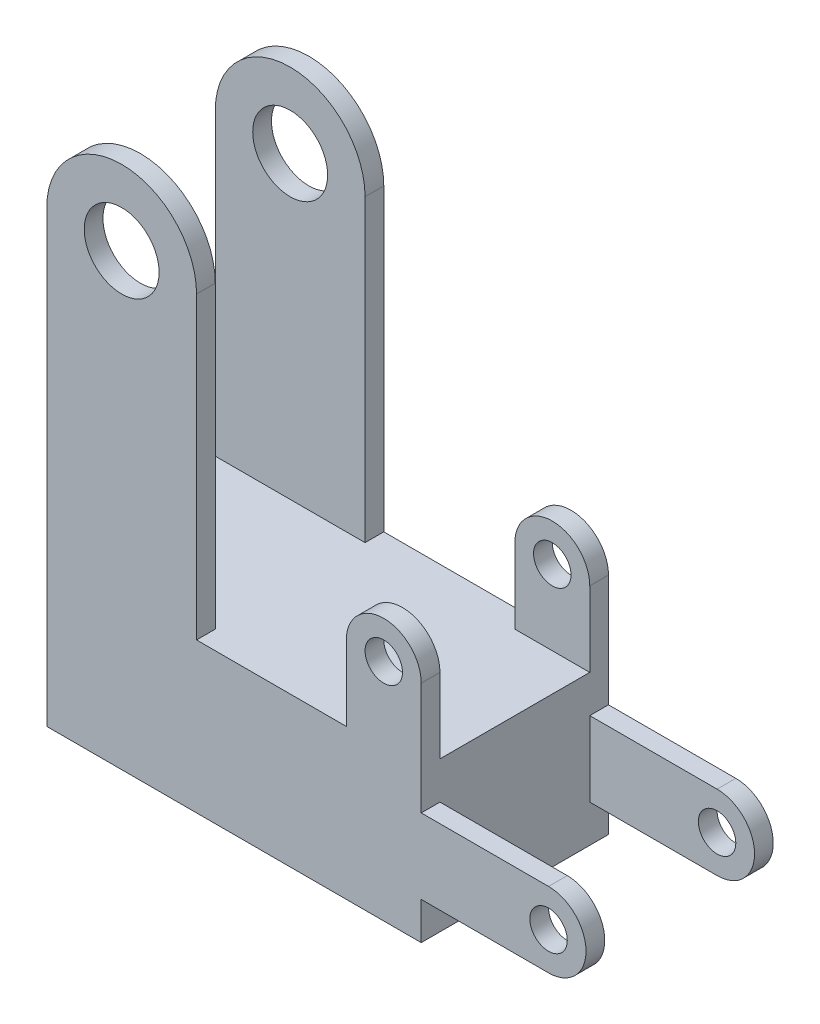
ISO-10303-21;
HEADER;
FILE_DESCRIPTION(('STEP AP214'),'2;1');
FILE_NAME('part.step','',(''),(''),'','','');
FILE_SCHEMA(('AUTOMOTIVE_DESIGN { 1 0 10303 214 1 1 1 1 }'));
ENDSEC;
DATA;
#1=APPLICATION_CONTEXT('core data for automotive mechanical design processes');
#2=APPLICATION_PROTOCOL_DEFINITION('international standard','automotive_design',2000,#1);
#3=PRODUCT_CONTEXT('',#1,'mechanical');
#4=PRODUCT('Part','Part','',(#3));
#5=PRODUCT_RELATED_PRODUCT_CATEGORY('part','',(#4));
#6=PRODUCT_DEFINITION_FORMATION('','',#4);
#7=PRODUCT_DEFINITION_CONTEXT('part definition',#1,'design');
#8=PRODUCT_DEFINITION('design','',#6,#7);
#9=PRODUCT_DEFINITION_SHAPE('','',#8);
#10=(LENGTH_UNIT() NAMED_UNIT(*) SI_UNIT(.MILLI.,.METRE.));
#11=(NAMED_UNIT(*) PLANE_ANGLE_UNIT() SI_UNIT($,.RADIAN.));
#12=(NAMED_UNIT(*) SI_UNIT($,.STERADIAN.) SOLID_ANGLE_UNIT());
#13=UNCERTAINTY_MEASURE_WITH_UNIT(LENGTH_MEASURE(1.E-05),#10,'distance_accuracy_value','');
#14=(GEOMETRIC_REPRESENTATION_CONTEXT(3) GLOBAL_UNCERTAINTY_ASSIGNED_CONTEXT((#13)) GLOBAL_UNIT_ASSIGNED_CONTEXT((#10,
#11,#12)) REPRESENTATION_CONTEXT('',''));
#15=CARTESIAN_POINT('',(0.,0.,0.));
#16=DIRECTION('',(0.,0.,1.));
#17=DIRECTION('',(1.,0.,0.));
#18=AXIS2_PLACEMENT_3D('',#15,#16,#17);
#19=CARTESIAN_POINT('',(17.9383444264069,-15.2443150098857,25.));
#20=DIRECTION('',(0.,1.,0.));
#21=DIRECTION('',(-1.,0.,0.));
#22=AXIS2_PLACEMENT_3D('',#19,#20,#21);
#23=PLANE('',#22);
#24=DIRECTION('',(0.,0.,-1.));
#25=VECTOR('',#24,1.);
#26=CARTESIAN_POINT('',(17.9383444264069,-15.2443150098857,25.));
#27=LINE('',#26,#25);
#28=CARTESIAN_POINT('',(17.9383444264069,-15.2443150098857,2.5));
#29=VERTEX_POINT('',#28);
#30=CARTESIAN_POINT('',(17.9383444264069,-15.2443150098857,0.));
#31=VERTEX_POINT('',#30);
#32=EDGE_CURVE('E235',#29,#31,#27,.T.);
#33=ORIENTED_EDGE('',*,*,#32,.F.);
#34=DIRECTION('',(1.,0.,0.));
#35=VECTOR('',#34,1.);
#36=CARTESIAN_POINT('',(0.938344426406875,-15.2443150098857,2.5));
#37=LINE('',#36,#35);
#38=CARTESIAN_POINT('',(0.938344426406876,-15.2443150098857,2.5));
#39=VERTEX_POINT('',#38);
#40=EDGE_CURVE('E219',#39,#29,#37,.T.);
#41=ORIENTED_EDGE('',*,*,#40,.F.);
#42=DIRECTION('',(0.,0.,-1.));
#43=VECTOR('',#42,1.);
#44=CARTESIAN_POINT('',(0.938344426406874,-15.2443150098857,25.));
#45=LINE('',#44,#43);
#46=CARTESIAN_POINT('',(0.938344426406874,-15.2443150098857,0.));
#47=VERTEX_POINT('',#46);
#48=EDGE_CURVE('E243',#39,#47,#45,.T.);
#49=ORIENTED_EDGE('',*,*,#48,.T.);
#50=DIRECTION('',(1.,0.,0.));
#51=VECTOR('',#50,1.);
#52=CARTESIAN_POINT('',(17.9383444264069,-15.2443150098857,0.));
#53=LINE('',#52,#51);
#54=EDGE_CURVE('E356',#47,#31,#53,.T.);
#55=ORIENTED_EDGE('',*,*,#54,.T.);
#56=EDGE_LOOP('',(#33,#41,#49,#55));
#57=FACE_BOUND('',#56,.T.);
#58=ADVANCED_FACE('F46',(#57),#23,.F.);
#59=CARTESIAN_POINT('',(17.9383444264069,-10.2443150098857,25.));
#60=DIRECTION('',(0.,0.,-1.));
#61=DIRECTION('',(-1.,0.,0.));
#62=AXIS2_PLACEMENT_3D('',#59,#60,#61);
#63=CYLINDRICAL_SURFACE('',#62,5.);
#64=DIRECTION('',(0.,0.,-1.));
#65=VECTOR('',#64,1.);
#66=CARTESIAN_POINT('',(17.9383444264069,-5.24431500988574,25.));
#67=LINE('',#66,#65);
#68=CARTESIAN_POINT('',(17.9383444264069,-5.24431500988574,2.5));
#69=VERTEX_POINT('',#68);
#70=CARTESIAN_POINT('',(17.9383444264069,-5.24431500988574,0.));
#71=VERTEX_POINT('',#70);
#72=EDGE_CURVE('E236',#69,#71,#67,.T.);
#73=ORIENTED_EDGE('',*,*,#72,.F.);
#74=CARTESIAN_POINT('',(17.9383444264069,-10.2443150098857,2.5));
#75=DIRECTION('',(0.,0.,-1.));
#76=DIRECTION('',(-1.,0.,0.));
#77=AXIS2_PLACEMENT_3D('',#74,#75,#76);
#78=CIRCLE('',#77,5.);
#79=EDGE_CURVE('E230',#29,#69,#78,.F.);
#80=ORIENTED_EDGE('',*,*,#79,.F.);
#81=ORIENTED_EDGE('',*,*,#32,.T.);
#82=CARTESIAN_POINT('',(17.9383444264069,-10.2443150098857,0.));
#83=DIRECTION('',(0.,0.,1.));
#84=DIRECTION('',(-1.,0.,0.));
#85=AXIS2_PLACEMENT_3D('',#82,#83,#84);
#86=CIRCLE('',#85,5.);
#87=EDGE_CURVE('E359',#31,#71,#86,.T.);
#88=ORIENTED_EDGE('',*,*,#87,.T.);
#89=EDGE_LOOP('',(#73,#80,#81,#88));
#90=FACE_BOUND('',#89,.T.);
#91=ADVANCED_FACE('F471',(#90),#63,.T.);
#92=CARTESIAN_POINT('',(0.938344426406872,-5.24431500988574,25.));
#93=DIRECTION('',(0.,-1.,0.));
#94=DIRECTION('',(0.,0.,-1.));
#95=AXIS2_PLACEMENT_3D('',#92,#93,#94);
#96=PLANE('',#95);
#97=DIRECTION('',(0.,0.,-1.));
#98=VECTOR('',#97,1.);
#99=CARTESIAN_POINT('',(0.938344426406872,-5.24431500988574,25.));
#100=LINE('',#99,#98);
#101=CARTESIAN_POINT('',(0.938344426406872,-5.24431500988574,2.5));
#102=VERTEX_POINT('',#101);
#103=CARTESIAN_POINT('',(0.938344426406872,-5.24431500988574,0.));
#104=VERTEX_POINT('',#103);
#105=EDGE_CURVE('E408',#102,#104,#100,.T.);
#106=ORIENTED_EDGE('',*,*,#105,.F.);
#107=DIRECTION('',(-1.,0.,0.));
#108=VECTOR('',#107,1.);
#109=CARTESIAN_POINT('',(0.938344426406876,-5.24431500988574,2.5));
#110=LINE('',#109,#108);
#111=EDGE_CURVE('E63',#69,#102,#110,.T.);
#112=ORIENTED_EDGE('',*,*,#111,.F.);
#113=ORIENTED_EDGE('',*,*,#72,.T.);
#114=DIRECTION('',(-1.,0.,0.));
#115=VECTOR('',#114,1.);
#116=CARTESIAN_POINT('',(0.938344426406872,-5.24431500988574,0.));
#117=LINE('',#116,#115);
#118=EDGE_CURVE('E362',#71,#104,#117,.T.);
#119=ORIENTED_EDGE('',*,*,#118,.T.);
#120=EDGE_LOOP('',(#106,#112,#113,#119));
#121=FACE_BOUND('',#120,.T.);
#122=ADVANCED_FACE('F467',(#121),#96,.F.);
#123=CARTESIAN_POINT('',(-4.06165557359312,9.75568499011426,25.));
#124=DIRECTION('',(0.,0.,-1.));
#125=DIRECTION('',(-1.,0.,0.));
#126=AXIS2_PLACEMENT_3D('',#123,#124,#125);
#127=CYLINDRICAL_SURFACE('',#126,5.);
#128=DIRECTION('',(0.,0.,-1.));
#129=VECTOR('',#128,1.);
#130=CARTESIAN_POINT('',(0.938344426406877,9.75568499011426,25.));
#131=LINE('',#130,#129);
#132=CARTESIAN_POINT('',(0.938344426406877,9.75568499011426,25.));
#133=VERTEX_POINT('',#132);
#134=CARTESIAN_POINT('',(0.938344426406877,9.75568499011426,22.5));
#135=VERTEX_POINT('',#134);
#136=EDGE_CURVE('E406',#133,#135,#131,.T.);
#137=ORIENTED_EDGE('',*,*,#136,.T.);
#138=CARTESIAN_POINT('',(-4.06165557359312,9.75568499011426,22.5));
#139=DIRECTION('',(0.,0.,1.));
#140=DIRECTION('',(1.,0.,0.));
#141=AXIS2_PLACEMENT_3D('',#138,#139,#140);
#142=CIRCLE('',#141,5.);
#143=CARTESIAN_POINT('',(-9.06165557359313,9.75568499011426,22.5));
#144=VERTEX_POINT('',#143);
#145=EDGE_CURVE('E318',#135,#144,#142,.T.);
#146=ORIENTED_EDGE('',*,*,#145,.T.);
#147=DIRECTION('',(0.,0.,-1.));
#148=VECTOR('',#147,1.);
#149=CARTESIAN_POINT('',(-9.06165557359313,9.75568499011426,25.));
#150=LINE('',#149,#148);
#151=CARTESIAN_POINT('',(-9.06165557359313,9.75568499011426,25.));
#152=VERTEX_POINT('',#151);
#153=EDGE_CURVE('E403',#152,#144,#150,.T.);
#154=ORIENTED_EDGE('',*,*,#153,.F.);
#155=CARTESIAN_POINT('',(-4.06165557359312,9.75568499011426,25.));
#156=DIRECTION('',(0.,0.,1.));
#157=DIRECTION('',(-1.,0.,0.));
#158=AXIS2_PLACEMENT_3D('',#155,#156,#157);
#159=CIRCLE('',#158,5.);
#160=EDGE_CURVE('E338',#133,#152,#159,.T.);
#161=ORIENTED_EDGE('',*,*,#160,.F.);
#162=EDGE_LOOP('',(#137,#146,#154,#161));
#163=FACE_BOUND('',#162,.T.);
#164=ADVANCED_FACE('F444',(#163),#127,.T.);
#165=CARTESIAN_POINT('',(-9.06165557359313,-0.244315009885743,25.));
#166=DIRECTION('',(1.,0.,0.));
#167=DIRECTION('',(0.,0.,-1.));
#168=AXIS2_PLACEMENT_3D('',#165,#166,#167);
#169=PLANE('',#168);
#170=ORIENTED_EDGE('',*,*,#153,.T.);
#171=DIRECTION('',(0.,-1.,0.));
#172=VECTOR('',#171,1.);
#173=CARTESIAN_POINT('',(-9.06165557359313,-0.244315009885743,22.5));
#174=LINE('',#173,#172);
#175=CARTESIAN_POINT('',(-9.06165557359313,-0.244315009885742,22.5));
#176=VERTEX_POINT('',#175);
#177=EDGE_CURVE('E315',#144,#176,#174,.T.);
#178=ORIENTED_EDGE('',*,*,#177,.T.);
#179=DIRECTION('',(0.,0.,-1.));
#180=VECTOR('',#179,1.);
#181=CARTESIAN_POINT('',(-9.06165557359313,-0.244315009885743,25.));
#182=LINE('',#181,#180);
#183=CARTESIAN_POINT('',(-9.06165557359313,-0.244315009885743,25.));
#184=VERTEX_POINT('',#183);
#185=EDGE_CURVE('E399',#184,#176,#182,.T.);
#186=ORIENTED_EDGE('',*,*,#185,.F.);
#187=DIRECTION('',(0.,-1.,0.));
#188=VECTOR('',#187,1.);
#189=CARTESIAN_POINT('',(-9.06165557359313,-0.244315009885743,25.));
#190=LINE('',#189,#188);
#191=EDGE_CURVE('E340',#152,#184,#190,.T.);
#192=ORIENTED_EDGE('',*,*,#191,.F.);
#193=EDGE_LOOP('',(#170,#178,#186,#192));
#194=FACE_BOUND('',#193,.T.);
#195=ADVANCED_FACE('F441',(#194),#169,.F.);
#196=CARTESIAN_POINT('',(-29.0616555735931,39.7556849901143,25.));
#197=DIRECTION('',(-1.,0.,0.));
#198=DIRECTION('',(0.,-1.,0.));
#199=AXIS2_PLACEMENT_3D('',#196,#197,#198);
#200=PLANE('',#199);
#201=DIRECTION('',(0.,0.,-1.));
#202=VECTOR('',#201,1.);
#203=CARTESIAN_POINT('',(-29.0616555735931,-0.244315009885744,25.));
#204=LINE('',#203,#202);
#205=CARTESIAN_POINT('',(-29.0616555735931,-0.244315009885744,25.));
#206=VERTEX_POINT('',#205);
#207=CARTESIAN_POINT('',(-29.0616555735931,-0.244315009885745,22.5));
#208=VERTEX_POINT('',#207);
#209=EDGE_CURVE('E395',#206,#208,#204,.T.);
#210=ORIENTED_EDGE('',*,*,#209,.T.);
#211=DIRECTION('',(0.,1.,0.));
#212=VECTOR('',#211,1.);
#213=CARTESIAN_POINT('',(-29.0616555735931,39.7556849901143,22.5));
#214=LINE('',#213,#212);
#215=CARTESIAN_POINT('',(-29.0616555735931,39.7556849901143,22.5));
#216=VERTEX_POINT('',#215);
#217=EDGE_CURVE('E312',#208,#216,#214,.T.);
#218=ORIENTED_EDGE('',*,*,#217,.T.);
#219=DIRECTION('',(0.,0.,-1.));
#220=VECTOR('',#219,1.);
#221=CARTESIAN_POINT('',(-29.0616555735931,39.7556849901143,25.));
#222=LINE('',#221,#220);
#223=CARTESIAN_POINT('',(-29.0616555735931,39.7556849901143,25.));
#224=VERTEX_POINT('',#223);
#225=EDGE_CURVE('E391',#224,#216,#222,.T.);
#226=ORIENTED_EDGE('',*,*,#225,.F.);
#227=DIRECTION('',(0.,1.,0.));
#228=VECTOR('',#227,1.);
#229=CARTESIAN_POINT('',(-29.0616555735931,39.7556849901143,25.));
#230=LINE('',#229,#228);
#231=EDGE_CURVE('E344',#206,#224,#230,.T.);
#232=ORIENTED_EDGE('',*,*,#231,.F.);
#233=EDGE_LOOP('',(#210,#218,#226,#232));
#234=FACE_BOUND('',#233,.T.);
#235=ADVANCED_FACE('F516',(#234),#200,.F.);
#236=CARTESIAN_POINT('',(-39.0616555735931,39.7556849901143,25.));
#237=DIRECTION('',(0.,0.,-1.));
#238=DIRECTION('',(-1.,0.,0.));
#239=AXIS2_PLACEMENT_3D('',#236,#237,#238);
#240=CYLINDRICAL_SURFACE('',#239,10.);
#241=ORIENTED_EDGE('',*,*,#225,.T.);
#242=CARTESIAN_POINT('',(-39.0616555735931,39.7556849901143,22.5));
#243=DIRECTION('',(0.,0.,1.));
#244=DIRECTION('',(1.,0.,0.));
#245=AXIS2_PLACEMENT_3D('',#242,#243,#244);
#246=CIRCLE('',#245,10.);
#247=CARTESIAN_POINT('',(-49.0616555735931,39.7556849901142,22.5));
#248=VERTEX_POINT('',#247);
#249=EDGE_CURVE('E309',#216,#248,#246,.T.);
#250=ORIENTED_EDGE('',*,*,#249,.T.);
#251=DIRECTION('',(0.,0.,-1.));
#252=VECTOR('',#251,1.);
#253=CARTESIAN_POINT('',(-49.0616555735931,39.7556849901143,25.));
#254=LINE('',#253,#252);
#255=CARTESIAN_POINT('',(-49.0616555735931,39.7556849901143,25.));
#256=VERTEX_POINT('',#255);
#257=EDGE_CURVE('E387',#256,#248,#254,.T.);
#258=ORIENTED_EDGE('',*,*,#257,.F.);
#259=CARTESIAN_POINT('',(-39.0616555735931,39.7556849901143,25.));
#260=DIRECTION('',(0.,0.,1.));
#261=DIRECTION('',(-1.,0.,0.));
#262=AXIS2_PLACEMENT_3D('',#259,#260,#261);
#263=CIRCLE('',#262,10.);
#264=EDGE_CURVE('E346',#224,#256,#263,.T.);
#265=ORIENTED_EDGE('',*,*,#264,.F.);
#266=EDGE_LOOP('',(#241,#250,#258,#265));
#267=FACE_BOUND('',#266,.T.);
#268=ADVANCED_FACE('F512',(#267),#240,.T.);
#269=CARTESIAN_POINT('',(-49.0616555735931,-20.2443150098857,25.));
#270=DIRECTION('',(0.,1.,0.));
#271=DIRECTION('',(-1.,0.,0.));
#272=AXIS2_PLACEMENT_3D('',#269,#270,#271);
#273=PLANE('',#272);
#274=DIRECTION('',(1.,0.,0.));
#275=VECTOR('',#274,1.);
#276=CARTESIAN_POINT('',(-49.0616555735931,-20.2443150098857,0.));
#277=LINE('',#276,#275);
#278=CARTESIAN_POINT('',(-49.0616555735931,-20.2443150098857,0.));
#279=VERTEX_POINT('',#278);
#280=CARTESIAN_POINT('',(0.938344426406875,-20.2443150098857,0.));
#281=VERTEX_POINT('',#280);
#282=EDGE_CURVE('E324',#279,#281,#277,.T.);
#283=ORIENTED_EDGE('',*,*,#282,.T.);
#284=DIRECTION('',(0.,0.,-1.));
#285=VECTOR('',#284,1.);
#286=CARTESIAN_POINT('',(0.938344426406875,-20.2443150098857,25.));
#287=LINE('',#286,#285);
#288=CARTESIAN_POINT('',(0.938344426406875,-20.2443150098857,25.));
#289=VERTEX_POINT('',#288);
#290=EDGE_CURVE('E55',#289,#281,#287,.T.);
#291=ORIENTED_EDGE('',*,*,#290,.F.);
#292=DIRECTION('',(1.,0.,0.));
#293=VECTOR('',#292,1.);
#294=CARTESIAN_POINT('',(-49.0616555735931,-20.2443150098857,25.));
#295=LINE('',#294,#293);
#296=CARTESIAN_POINT('',(-49.0616555735931,-20.2443150098857,25.));
#297=VERTEX_POINT('',#296);
#298=EDGE_CURVE('E325',#297,#289,#295,.T.);
#299=ORIENTED_EDGE('',*,*,#298,.F.);
#300=DIRECTION('',(0.,0.,-1.));
#301=VECTOR('',#300,1.);
#302=CARTESIAN_POINT('',(-49.0616555735931,-20.2443150098857,25.));
#303=LINE('',#302,#301);
#304=EDGE_CURVE('E350',#297,#279,#303,.T.);
#305=ORIENTED_EDGE('',*,*,#304,.T.);
#306=EDGE_LOOP('',(#283,#291,#299,#305));
#307=FACE_BOUND('',#306,.T.);
#308=ADVANCED_FACE('F48',(#307),#273,.F.);
#309=CARTESIAN_POINT('',(0.938344426406874,-15.2443150098857,25.));
#310=VERTEX_POINT('',#309);
#311=CARTESIAN_POINT('',(0.938344426406876,-15.2443150098857,22.5));
#312=VERTEX_POINT('',#311);
#313=EDGE_CURVE('E244',#310,#312,#45,.T.);
#314=ORIENTED_EDGE('',*,*,#313,.T.);
#315=DIRECTION('',(-1.,0.,0.));
#316=VECTOR('',#315,1.);
#317=CARTESIAN_POINT('',(0.938344426406875,-15.2443150098857,22.5));
#318=LINE('',#317,#316);
#319=CARTESIAN_POINT('',(17.9383444264069,-15.2443150098857,22.5));
#320=VERTEX_POINT('',#319);
#321=EDGE_CURVE('E268',#320,#312,#318,.T.);
#322=ORIENTED_EDGE('',*,*,#321,.F.);
#323=CARTESIAN_POINT('',(17.9383444264069,-15.2443150098857,25.));
#324=VERTEX_POINT('',#323);
#325=EDGE_CURVE('E229',#324,#320,#27,.T.);
#326=ORIENTED_EDGE('',*,*,#325,.F.);
#327=DIRECTION('',(1.,0.,0.));
#328=VECTOR('',#327,1.);
#329=CARTESIAN_POINT('',(17.9383444264069,-15.2443150098857,25.));
#330=LINE('',#329,#328);
#331=EDGE_CURVE('E331',#310,#324,#330,.T.);
#332=ORIENTED_EDGE('',*,*,#331,.F.);
#333=EDGE_LOOP('',(#314,#322,#326,#332));
#334=FACE_BOUND('',#333,.T.);
#335=ADVANCED_FACE('F452',(#334),#23,.F.);
#336=ORIENTED_EDGE('',*,*,#325,.T.);
#337=CARTESIAN_POINT('',(17.9383444264069,-10.2443150098857,22.5));
#338=DIRECTION('',(0.,0.,1.));
#339=DIRECTION('',(1.,0.,0.));
#340=AXIS2_PLACEMENT_3D('',#337,#338,#339);
#341=CIRCLE('',#340,5.);
#342=CARTESIAN_POINT('',(17.9383444264069,-5.24431500988574,22.5));
#343=VERTEX_POINT('',#342);
#344=EDGE_CURVE('E212',#343,#320,#341,.F.);
#345=ORIENTED_EDGE('',*,*,#344,.F.);
#346=CARTESIAN_POINT('',(17.9383444264069,-5.24431500988574,25.));
#347=VERTEX_POINT('',#346);
#348=EDGE_CURVE('E226',#347,#343,#67,.T.);
#349=ORIENTED_EDGE('',*,*,#348,.F.);
#350=CARTESIAN_POINT('',(17.9383444264069,-10.2443150098857,25.));
#351=DIRECTION('',(0.,0.,1.));
#352=DIRECTION('',(-1.,0.,0.));
#353=AXIS2_PLACEMENT_3D('',#350,#351,#352);
#354=CIRCLE('',#353,5.);
#355=EDGE_CURVE('E333',#324,#347,#354,.T.);
#356=ORIENTED_EDGE('',*,*,#355,.F.);
#357=EDGE_LOOP('',(#336,#345,#349,#356));
#358=FACE_BOUND('',#357,.T.);
#359=ADVANCED_FACE('F224',(#358),#63,.T.);
#360=ORIENTED_EDGE('',*,*,#348,.T.);
#361=DIRECTION('',(1.,0.,0.));
#362=VECTOR('',#361,1.);
#363=CARTESIAN_POINT('',(0.938344426406876,-5.24431500988574,22.5));
#364=LINE('',#363,#362);
#365=CARTESIAN_POINT('',(0.938344426406876,-5.24431500988574,22.5));
#366=VERTEX_POINT('',#365);
#367=EDGE_CURVE('E208',#366,#343,#364,.T.);
#368=ORIENTED_EDGE('',*,*,#367,.F.);
#369=CARTESIAN_POINT('',(0.938344426406872,-5.24431500988574,25.));
#370=VERTEX_POINT('',#369);
#371=EDGE_CURVE('E239',#370,#366,#100,.T.);
#372=ORIENTED_EDGE('',*,*,#371,.F.);
#373=DIRECTION('',(-1.,0.,0.));
#374=VECTOR('',#373,1.);
#375=CARTESIAN_POINT('',(0.938344426406872,-5.24431500988574,25.));
#376=LINE('',#375,#374);
#377=EDGE_CURVE('E234',#347,#370,#376,.T.);
#378=ORIENTED_EDGE('',*,*,#377,.F.);
#379=EDGE_LOOP('',(#360,#368,#372,#378));
#380=FACE_BOUND('',#379,.T.);
#381=ADVANCED_FACE('F233',(#380),#96,.F.);
#382=CARTESIAN_POINT('',(0.938344426406875,9.75568499011426,25.));
#383=DIRECTION('',(-1.,0.,0.));
#384=DIRECTION('',(0.,-1.,0.));
#385=AXIS2_PLACEMENT_3D('',#382,#383,#384);
#386=PLANE('',#385);
#387=DIRECTION('',(0.,0.,1.));
#388=VECTOR('',#387,1.);
#389=CARTESIAN_POINT('',(0.938344426406873,-0.24431500988574,25.));
#390=LINE('',#389,#388);
#391=CARTESIAN_POINT('',(0.938344426406876,-0.24431500988574,2.5));
#392=VERTEX_POINT('',#391);
#393=CARTESIAN_POINT('',(0.938344426406876,-0.24431500988574,22.5));
#394=VERTEX_POINT('',#393);
#395=EDGE_CURVE('E288',#392,#394,#390,.T.);
#396=ORIENTED_EDGE('',*,*,#395,.T.);
#397=DIRECTION('',(0.,1.,0.));
#398=VECTOR('',#397,1.);
#399=CARTESIAN_POINT('',(0.938344426406875,9.75568499011426,22.5));
#400=LINE('',#399,#398);
#401=EDGE_CURVE('E321',#394,#135,#400,.T.);
#402=ORIENTED_EDGE('',*,*,#401,.T.);
#403=ORIENTED_EDGE('',*,*,#136,.F.);
#404=DIRECTION('',(0.,1.,0.));
#405=VECTOR('',#404,1.);
#406=CARTESIAN_POINT('',(0.938344426406875,9.75568499011426,25.));
#407=LINE('',#406,#405);
#408=EDGE_CURVE('E336',#370,#133,#407,.T.);
#409=ORIENTED_EDGE('',*,*,#408,.F.);
#410=ORIENTED_EDGE('',*,*,#371,.T.);
#411=DIRECTION('',(0.,1.,0.));
#412=VECTOR('',#411,1.);
#413=CARTESIAN_POINT('',(0.938344426406876,-20.2453150098857,22.5));
#414=LINE('',#413,#412);
#415=EDGE_CURVE('E214',#312,#366,#414,.T.);
#416=ORIENTED_EDGE('',*,*,#415,.F.);
#417=ORIENTED_EDGE('',*,*,#313,.F.);
#418=DIRECTION('',(0.,1.,0.));
#419=VECTOR('',#418,1.);
#420=CARTESIAN_POINT('',(0.938344426406874,-15.2443150098857,25.));
#421=LINE('',#420,#419);
#422=EDGE_CURVE('E328',#289,#310,#421,.T.);
#423=ORIENTED_EDGE('',*,*,#422,.F.);
#424=ORIENTED_EDGE('',*,*,#290,.T.);
#425=DIRECTION('',(0.,1.,0.));
#426=VECTOR('',#425,1.);
#427=CARTESIAN_POINT('',(0.938344426406874,-15.2443150098857,0.));
#428=LINE('',#427,#426);
#429=EDGE_CURVE('E353',#281,#47,#428,.T.);
#430=ORIENTED_EDGE('',*,*,#429,.T.);
#431=ORIENTED_EDGE('',*,*,#48,.F.);
#432=DIRECTION('',(0.,1.,0.));
#433=VECTOR('',#432,1.);
#434=CARTESIAN_POINT('',(0.938344426406876,-20.2453150098857,2.5));
#435=LINE('',#434,#433);
#436=EDGE_CURVE('E450',#39,#102,#435,.T.);
#437=ORIENTED_EDGE('',*,*,#436,.T.);
#438=ORIENTED_EDGE('',*,*,#105,.T.);
#439=DIRECTION('',(0.,1.,0.));
#440=VECTOR('',#439,1.);
#441=CARTESIAN_POINT('',(0.938344426406875,9.75568499011426,0.));
#442=LINE('',#441,#440);
#443=CARTESIAN_POINT('',(0.938344426406877,9.75568499011426,0.));
#444=VERTEX_POINT('',#443);
#445=EDGE_CURVE('E365',#104,#444,#442,.T.);
#446=ORIENTED_EDGE('',*,*,#445,.T.);
#447=CARTESIAN_POINT('',(0.938344426406877,9.75568499011426,2.5));
#448=VERTEX_POINT('',#447);
#449=EDGE_CURVE('E405',#448,#444,#131,.T.);
#450=ORIENTED_EDGE('',*,*,#449,.F.);
#451=DIRECTION('',(0.,-1.,0.));
#452=VECTOR('',#451,1.);
#453=CARTESIAN_POINT('',(0.938344426406875,9.75568499011426,2.5));
#454=LINE('',#453,#452);
#455=EDGE_CURVE('E306',#448,#392,#454,.T.);
#456=ORIENTED_EDGE('',*,*,#455,.T.);
#457=EDGE_LOOP('',(#396,#402,#403,#409,#410,#416,#417,#423,#424,#430,#431,#437,#438,#446,#450,#456));
#458=FACE_BOUND('',#457,.T.);
#459=ADVANCED_FACE('F420',(#458),#386,.F.);
#460=CARTESIAN_POINT('',(-9.06165557359313,9.75568499011426,2.5));
#461=VERTEX_POINT('',#460);
#462=CARTESIAN_POINT('',(-9.06165557359313,9.75568499011426,0.));
#463=VERTEX_POINT('',#462);
#464=EDGE_CURVE('E402',#461,#463,#150,.T.);
#465=ORIENTED_EDGE('',*,*,#464,.F.);
#466=CARTESIAN_POINT('',(-4.06165557359312,9.75568499011426,2.5));
#467=DIRECTION('',(0.,0.,-1.));
#468=DIRECTION('',(-1.,0.,0.));
#469=AXIS2_PLACEMENT_3D('',#466,#467,#468);
#470=CIRCLE('',#469,5.);
#471=EDGE_CURVE('E303',#461,#448,#470,.T.);
#472=ORIENTED_EDGE('',*,*,#471,.T.);
#473=ORIENTED_EDGE('',*,*,#449,.T.);
#474=CARTESIAN_POINT('',(-4.06165557359312,9.75568499011426,0.));
#475=DIRECTION('',(0.,0.,1.));
#476=DIRECTION('',(-1.,0.,0.));
#477=AXIS2_PLACEMENT_3D('',#474,#475,#476);
#478=CIRCLE('',#477,5.);
#479=EDGE_CURVE('E368',#444,#463,#478,.T.);
#480=ORIENTED_EDGE('',*,*,#479,.T.);
#481=EDGE_LOOP('',(#465,#472,#473,#480));
#482=FACE_BOUND('',#481,.T.);
#483=ADVANCED_FACE('F415',(#482),#127,.T.);
#484=CARTESIAN_POINT('',(-9.06165557359313,-0.244315009885743,2.5));
#485=VERTEX_POINT('',#484);
#486=CARTESIAN_POINT('',(-9.06165557359313,-0.244315009885743,0.));
#487=VERTEX_POINT('',#486);
#488=EDGE_CURVE('E398',#485,#487,#182,.T.);
#489=ORIENTED_EDGE('',*,*,#488,.F.);
#490=DIRECTION('',(0.,1.,0.));
#491=VECTOR('',#490,1.);
#492=CARTESIAN_POINT('',(-9.06165557359313,-0.244315009885743,2.5));
#493=LINE('',#492,#491);
#494=EDGE_CURVE('E300',#485,#461,#493,.T.);
#495=ORIENTED_EDGE('',*,*,#494,.T.);
#496=ORIENTED_EDGE('',*,*,#464,.T.);
#497=DIRECTION('',(0.,-1.,0.));
#498=VECTOR('',#497,1.);
#499=CARTESIAN_POINT('',(-9.06165557359313,-0.244315009885743,0.));
#500=LINE('',#499,#498);
#501=EDGE_CURVE('E371',#463,#487,#500,.T.);
#502=ORIENTED_EDGE('',*,*,#501,.T.);
#503=EDGE_LOOP('',(#489,#495,#496,#502));
#504=FACE_BOUND('',#503,.T.);
#505=ADVANCED_FACE('F430',(#504),#169,.F.);
#506=CARTESIAN_POINT('',(-29.0616555735931,-0.244315009885744,25.));
#507=DIRECTION('',(0.,-1.,0.));
#508=DIRECTION('',(1.,0.,0.));
#509=AXIS2_PLACEMENT_3D('',#506,#507,#508);
#510=PLANE('',#509);
#511=CARTESIAN_POINT('',(-29.0616555735931,-0.244315009885745,2.5));
#512=VERTEX_POINT('',#511);
#513=CARTESIAN_POINT('',(-29.0616555735931,-0.244315009885744,0.));
#514=VERTEX_POINT('',#513);
#515=EDGE_CURVE('E394',#512,#514,#204,.T.);
#516=ORIENTED_EDGE('',*,*,#515,.F.);
#517=DIRECTION('',(1.,0.,0.));
#518=VECTOR('',#517,1.);
#519=CARTESIAN_POINT('',(-49.0616555735931,-0.244315009885748,2.5));
#520=LINE('',#519,#518);
#521=CARTESIAN_POINT('',(-49.0616555735931,-0.244315009885747,2.5));
#522=VERTEX_POINT('',#521);
#523=EDGE_CURVE('E286',#522,#512,#520,.T.);
#524=ORIENTED_EDGE('',*,*,#523,.F.);
#525=DIRECTION('',(0.,0.,-1.));
#526=VECTOR('',#525,1.);
#527=CARTESIAN_POINT('',(-49.0616555735931,-0.244315009885748,22.5));
#528=LINE('',#527,#526);
#529=CARTESIAN_POINT('',(-49.0616555735931,-0.244315009885748,22.5));
#530=VERTEX_POINT('',#529);
#531=EDGE_CURVE('E279',#530,#522,#528,.T.);
#532=ORIENTED_EDGE('',*,*,#531,.F.);
#533=DIRECTION('',(1.,0.,0.));
#534=VECTOR('',#533,1.);
#535=CARTESIAN_POINT('',(-49.0616555735931,-0.244315009885748,22.5));
#536=LINE('',#535,#534);
#537=EDGE_CURVE('E289',#530,#208,#536,.T.);
#538=ORIENTED_EDGE('',*,*,#537,.T.);
#539=ORIENTED_EDGE('',*,*,#209,.F.);
#540=DIRECTION('',(-1.,0.,0.));
#541=VECTOR('',#540,1.);
#542=CARTESIAN_POINT('',(-29.0616555735931,-0.244315009885744,25.));
#543=LINE('',#542,#541);
#544=EDGE_CURVE('E342',#184,#206,#543,.T.);
#545=ORIENTED_EDGE('',*,*,#544,.F.);
#546=ORIENTED_EDGE('',*,*,#185,.T.);
#547=EDGE_CURVE('E285',#176,#394,#536,.T.);
#548=ORIENTED_EDGE('',*,*,#547,.T.);
#549=ORIENTED_EDGE('',*,*,#395,.F.);
#550=EDGE_CURVE('E71',#485,#392,#520,.T.);
#551=ORIENTED_EDGE('',*,*,#550,.F.);
#552=ORIENTED_EDGE('',*,*,#488,.T.);
#553=DIRECTION('',(-1.,0.,0.));
#554=VECTOR('',#553,1.);
#555=CARTESIAN_POINT('',(-29.0616555735931,-0.244315009885744,0.));
#556=LINE('',#555,#554);
#557=EDGE_CURVE('E374',#487,#514,#556,.T.);
#558=ORIENTED_EDGE('',*,*,#557,.T.);
#559=EDGE_LOOP('',(#516,#524,#532,#538,#539,#545,#546,#548,#549,#551,#552,#558));
#560=FACE_BOUND('',#559,.T.);
#561=ADVANCED_FACE('F435',(#560),#510,.F.);
#562=CARTESIAN_POINT('',(-29.0616555735931,39.7556849901143,2.5));
#563=VERTEX_POINT('',#562);
#564=CARTESIAN_POINT('',(-29.0616555735931,39.7556849901143,0.));
#565=VERTEX_POINT('',#564);
#566=EDGE_CURVE('E390',#563,#565,#222,.T.);
#567=ORIENTED_EDGE('',*,*,#566,.F.);
#568=DIRECTION('',(0.,-1.,0.));
#569=VECTOR('',#568,1.);
#570=CARTESIAN_POINT('',(-29.0616555735931,39.7556849901143,2.5));
#571=LINE('',#570,#569);
#572=EDGE_CURVE('E297',#563,#512,#571,.T.);
#573=ORIENTED_EDGE('',*,*,#572,.T.);
#574=ORIENTED_EDGE('',*,*,#515,.T.);
#575=DIRECTION('',(0.,1.,0.));
#576=VECTOR('',#575,1.);
#577=CARTESIAN_POINT('',(-29.0616555735931,39.7556849901143,0.));
#578=LINE('',#577,#576);
#579=EDGE_CURVE('E377',#514,#565,#578,.T.);
#580=ORIENTED_EDGE('',*,*,#579,.T.);
#581=EDGE_LOOP('',(#567,#573,#574,#580));
#582=FACE_BOUND('',#581,.T.);
#583=ADVANCED_FACE('F525',(#582),#200,.F.);
#584=CARTESIAN_POINT('',(-49.0616555735931,39.7556849901142,2.5));
#585=VERTEX_POINT('',#584);
#586=CARTESIAN_POINT('',(-49.0616555735931,39.7556849901143,0.));
#587=VERTEX_POINT('',#586);
#588=EDGE_CURVE('E386',#585,#587,#254,.T.);
#589=ORIENTED_EDGE('',*,*,#588,.F.);
#590=CARTESIAN_POINT('',(-39.0616555735931,39.7556849901143,2.5));
#591=DIRECTION('',(0.,0.,-1.));
#592=DIRECTION('',(-1.,0.,0.));
#593=AXIS2_PLACEMENT_3D('',#590,#591,#592);
#594=CIRCLE('',#593,10.);
#595=EDGE_CURVE('E294',#585,#563,#594,.T.);
#596=ORIENTED_EDGE('',*,*,#595,.T.);
#597=ORIENTED_EDGE('',*,*,#566,.T.);
#598=CARTESIAN_POINT('',(-39.0616555735931,39.7556849901143,0.));
#599=DIRECTION('',(0.,0.,1.));
#600=DIRECTION('',(-1.,0.,0.));
#601=AXIS2_PLACEMENT_3D('',#598,#599,#600);
#602=CIRCLE('',#601,10.);
#603=EDGE_CURVE('E380',#565,#587,#602,.T.);
#604=ORIENTED_EDGE('',*,*,#603,.T.);
#605=EDGE_LOOP('',(#589,#596,#597,#604));
#606=FACE_BOUND('',#605,.T.);
#607=ADVANCED_FACE('F519',(#606),#240,.T.);
#608=CARTESIAN_POINT('',(-49.0616555735931,-20.2443150098857,25.));
#609=DIRECTION('',(1.,0.,0.));
#610=DIRECTION('',(0.,0.,-1.));
#611=AXIS2_PLACEMENT_3D('',#608,#609,#610);
#612=PLANE('',#611);
#613=ORIENTED_EDGE('',*,*,#257,.T.);
#614=DIRECTION('',(0.,-1.,0.));
#615=VECTOR('',#614,1.);
#616=CARTESIAN_POINT('',(-49.0616555735931,-20.2443150098857,22.5));
#617=LINE('',#616,#615);
#618=EDGE_CURVE('E13',#248,#530,#617,.T.);
#619=ORIENTED_EDGE('',*,*,#618,.T.);
#620=ORIENTED_EDGE('',*,*,#531,.T.);
#621=DIRECTION('',(0.,1.,0.));
#622=VECTOR('',#621,1.);
#623=CARTESIAN_POINT('',(-49.0616555735931,-0.244315009885748,2.5));
#624=LINE('',#623,#622);
#625=EDGE_CURVE('E282',#522,#585,#624,.T.);
#626=ORIENTED_EDGE('',*,*,#625,.T.);
#627=ORIENTED_EDGE('',*,*,#588,.T.);
#628=DIRECTION('',(0.,-1.,0.));
#629=VECTOR('',#628,1.);
#630=CARTESIAN_POINT('',(-49.0616555735931,-20.2443150098857,0.));
#631=LINE('',#630,#629);
#632=EDGE_CURVE('E329',#587,#279,#631,.T.);
#633=ORIENTED_EDGE('',*,*,#632,.T.);
#634=ORIENTED_EDGE('',*,*,#304,.F.);
#635=DIRECTION('',(0.,-1.,0.));
#636=VECTOR('',#635,1.);
#637=CARTESIAN_POINT('',(-49.0616555735931,-20.2443150098857,25.));
#638=LINE('',#637,#636);
#639=EDGE_CURVE('E348',#256,#297,#638,.T.);
#640=ORIENTED_EDGE('',*,*,#639,.F.);
#641=EDGE_LOOP('',(#613,#619,#620,#626,#627,#633,#634,#640));
#642=FACE_BOUND('',#641,.T.);
#643=ADVANCED_FACE('F528',(#642),#612,.F.);
#644=CARTESIAN_POINT('',(17.9383444264069,-10.2443150098857,25.));
#645=DIRECTION('',(0.,0.,-1.));
#646=DIRECTION('',(-1.,0.,0.));
#647=AXIS2_PLACEMENT_3D('',#644,#645,#646);
#648=PLANE('',#647);
#649=CARTESIAN_POINT('',(17.9383444264069,-10.2443150098857,25.));
#650=DIRECTION('',(0.,0.,1.));
#651=DIRECTION('',(1.,0.,0.));
#652=AXIS2_PLACEMENT_3D('',#649,#650,#651);
#653=CIRCLE('',#652,2.5);
#654=CARTESIAN_POINT('',(20.4383444264069,-10.2443150098857,25.));
#655=VERTEX_POINT('',#654);
#656=EDGE_CURVE('E478',#655,#655,#653,.T.);
#657=ORIENTED_EDGE('',*,*,#656,.F.);
#658=EDGE_LOOP('',(#657));
#659=FACE_BOUND('',#658,.T.);
#660=CARTESIAN_POINT('',(-4.06165557359312,9.75568499011426,25.));
#661=DIRECTION('',(0.,0.,1.));
#662=DIRECTION('',(1.,0.,0.));
#663=AXIS2_PLACEMENT_3D('',#660,#661,#662);
#664=CIRCLE('',#663,2.5);
#665=CARTESIAN_POINT('',(-1.56165557359312,9.75568499011426,25.));
#666=VERTEX_POINT('',#665);
#667=EDGE_CURVE('E263',#666,#666,#664,.T.);
#668=ORIENTED_EDGE('',*,*,#667,.F.);
#669=EDGE_LOOP('',(#668));
#670=FACE_BOUND('',#669,.T.);
#671=CARTESIAN_POINT('',(-39.0616555735931,39.7556849901143,25.));
#672=DIRECTION('',(0.,0.,1.));
#673=DIRECTION('',(1.,0.,0.));
#674=AXIS2_PLACEMENT_3D('',#671,#672,#673);
#675=CIRCLE('',#674,5.);
#676=CARTESIAN_POINT('',(-34.0616555735931,39.7556849901143,25.));
#677=VERTEX_POINT('',#676);
#678=EDGE_CURVE('E260',#677,#677,#675,.T.);
#679=ORIENTED_EDGE('',*,*,#678,.F.);
#680=EDGE_LOOP('',(#679));
#681=FACE_BOUND('',#680,.T.);
#682=ORIENTED_EDGE('',*,*,#298,.T.);
#683=ORIENTED_EDGE('',*,*,#422,.T.);
#684=ORIENTED_EDGE('',*,*,#331,.T.);
#685=ORIENTED_EDGE('',*,*,#355,.T.);
#686=ORIENTED_EDGE('',*,*,#377,.T.);
#687=ORIENTED_EDGE('',*,*,#408,.T.);
#688=ORIENTED_EDGE('',*,*,#160,.T.);
#689=ORIENTED_EDGE('',*,*,#191,.T.);
#690=ORIENTED_EDGE('',*,*,#544,.T.);
#691=ORIENTED_EDGE('',*,*,#231,.T.);
#692=ORIENTED_EDGE('',*,*,#264,.T.);
#693=ORIENTED_EDGE('',*,*,#639,.T.);
#694=EDGE_LOOP('',(#682,#683,#684,#685,#686,#687,#688,#689,#690,#691,#692,#693));
#695=FACE_BOUND('',#694,.T.);
#696=ADVANCED_FACE('F446',(#659,#670,#681,#695),#648,.F.);
#697=CARTESIAN_POINT('',(17.9383444264069,-10.2443150098857,0.));
#698=DIRECTION('',(0.,0.,-1.));
#699=DIRECTION('',(-1.,0.,0.));
#700=AXIS2_PLACEMENT_3D('',#697,#698,#699);
#701=PLANE('',#700);
#702=CARTESIAN_POINT('',(17.9383444264069,-10.2443150098857,0.));
#703=DIRECTION('',(0.,0.,1.));
#704=DIRECTION('',(1.,0.,0.));
#705=AXIS2_PLACEMENT_3D('',#702,#703,#704);
#706=CIRCLE('',#705,2.5);
#707=CARTESIAN_POINT('',(20.4383444264069,-10.2443150098857,0.));
#708=VERTEX_POINT('',#707);
#709=EDGE_CURVE('E481',#708,#708,#706,.T.);
#710=ORIENTED_EDGE('',*,*,#709,.T.);
#711=EDGE_LOOP('',(#710));
#712=FACE_BOUND('',#711,.T.);
#713=CARTESIAN_POINT('',(-4.06165557359312,9.75568499011426,0.));
#714=DIRECTION('',(0.,0.,1.));
#715=DIRECTION('',(1.,0.,0.));
#716=AXIS2_PLACEMENT_3D('',#713,#714,#715);
#717=CIRCLE('',#716,2.5);
#718=CARTESIAN_POINT('',(-1.56165557359312,9.75568499011426,0.));
#719=VERTEX_POINT('',#718);
#720=EDGE_CURVE('E256',#719,#719,#717,.T.);
#721=ORIENTED_EDGE('',*,*,#720,.T.);
#722=EDGE_LOOP('',(#721));
#723=FACE_BOUND('',#722,.T.);
#724=CARTESIAN_POINT('',(-39.0616555735931,39.7556849901143,0.));
#725=DIRECTION('',(0.,0.,1.));
#726=DIRECTION('',(1.,0.,0.));
#727=AXIS2_PLACEMENT_3D('',#724,#725,#726);
#728=CIRCLE('',#727,5.);
#729=CARTESIAN_POINT('',(-34.0616555735931,39.7556849901143,0.));
#730=VERTEX_POINT('',#729);
#731=EDGE_CURVE('E252',#730,#730,#728,.T.);
#732=ORIENTED_EDGE('',*,*,#731,.T.);
#733=EDGE_LOOP('',(#732));
#734=FACE_BOUND('',#733,.T.);
#735=ORIENTED_EDGE('',*,*,#282,.F.);
#736=ORIENTED_EDGE('',*,*,#632,.F.);
#737=ORIENTED_EDGE('',*,*,#603,.F.);
#738=ORIENTED_EDGE('',*,*,#579,.F.);
#739=ORIENTED_EDGE('',*,*,#557,.F.);
#740=ORIENTED_EDGE('',*,*,#501,.F.);
#741=ORIENTED_EDGE('',*,*,#479,.F.);
#742=ORIENTED_EDGE('',*,*,#445,.F.);
#743=ORIENTED_EDGE('',*,*,#118,.F.);
#744=ORIENTED_EDGE('',*,*,#87,.F.);
#745=ORIENTED_EDGE('',*,*,#54,.F.);
#746=ORIENTED_EDGE('',*,*,#429,.F.);
#747=EDGE_LOOP('',(#735,#736,#737,#738,#739,#740,#741,#742,#743,#744,#745,#746));
#748=FACE_BOUND('',#747,.T.);
#749=ADVANCED_FACE('F425',(#712,#723,#734,#748),#701,.T.);
#750=CARTESIAN_POINT('',(-49.0616555735931,-0.244315009885748,2.5));
#751=DIRECTION('',(0.,0.,-1.));
#752=DIRECTION('',(-1.,0.,0.));
#753=AXIS2_PLACEMENT_3D('',#750,#751,#752);
#754=PLANE('',#753);
#755=CARTESIAN_POINT('',(-39.0616555735931,39.7556849901143,2.5));
#756=DIRECTION('',(0.,0.,-1.));
#757=DIRECTION('',(-1.,0.,0.));
#758=AXIS2_PLACEMENT_3D('',#755,#756,#757);
#759=CIRCLE('',#758,5.);
#760=CARTESIAN_POINT('',(-44.0616555735931,39.7556849901143,2.5));
#761=VERTEX_POINT('',#760);
#762=EDGE_CURVE('E251',#761,#761,#759,.T.);
#763=ORIENTED_EDGE('',*,*,#762,.T.);
#764=EDGE_LOOP('',(#763));
#765=FACE_BOUND('',#764,.T.);
#766=ORIENTED_EDGE('',*,*,#595,.F.);
#767=ORIENTED_EDGE('',*,*,#625,.F.);
#768=ORIENTED_EDGE('',*,*,#523,.T.);
#769=ORIENTED_EDGE('',*,*,#572,.F.);
#770=EDGE_LOOP('',(#766,#767,#768,#769));
#771=FACE_BOUND('',#770,.T.);
#772=ADVANCED_FACE('F541',(#765,#771),#754,.F.);
#773=CARTESIAN_POINT('',(-49.0616555735931,-0.244315009885748,22.5));
#774=DIRECTION('',(0.,0.,1.));
#775=DIRECTION('',(1.,0.,0.));
#776=AXIS2_PLACEMENT_3D('',#773,#774,#775);
#777=PLANE('',#776);
#778=CARTESIAN_POINT('',(-39.0616555735931,39.7556849901143,22.5));
#779=DIRECTION('',(0.,0.,1.));
#780=DIRECTION('',(1.,0.,0.));
#781=AXIS2_PLACEMENT_3D('',#778,#779,#780);
#782=CIRCLE('',#781,5.);
#783=CARTESIAN_POINT('',(-34.0616555735931,39.7556849901143,22.5));
#784=VERTEX_POINT('',#783);
#785=EDGE_CURVE('E249',#784,#784,#782,.T.);
#786=ORIENTED_EDGE('',*,*,#785,.T.);
#787=EDGE_LOOP('',(#786));
#788=FACE_BOUND('',#787,.T.);
#789=ORIENTED_EDGE('',*,*,#537,.F.);
#790=ORIENTED_EDGE('',*,*,#618,.F.);
#791=ORIENTED_EDGE('',*,*,#249,.F.);
#792=ORIENTED_EDGE('',*,*,#217,.F.);
#793=EDGE_LOOP('',(#789,#790,#791,#792));
#794=FACE_BOUND('',#793,.T.);
#795=ADVANCED_FACE('F546',(#788,#794),#777,.F.);
#796=CARTESIAN_POINT('',(-4.06165557359312,9.75568499011426,22.5));
#797=DIRECTION('',(0.,0.,1.));
#798=DIRECTION('',(1.,0.,0.));
#799=AXIS2_PLACEMENT_3D('',#796,#797,#798);
#800=CIRCLE('',#799,2.5);
#801=CARTESIAN_POINT('',(-1.56165557359312,9.75568499011426,22.5));
#802=VERTEX_POINT('',#801);
#803=EDGE_CURVE('E255',#802,#802,#800,.T.);
#804=ORIENTED_EDGE('',*,*,#803,.T.);
#805=EDGE_LOOP('',(#804));
#806=FACE_BOUND('',#805,.T.);
#807=ORIENTED_EDGE('',*,*,#547,.F.);
#808=ORIENTED_EDGE('',*,*,#177,.F.);
#809=ORIENTED_EDGE('',*,*,#145,.F.);
#810=ORIENTED_EDGE('',*,*,#401,.F.);
#811=EDGE_LOOP('',(#807,#808,#809,#810));
#812=FACE_BOUND('',#811,.T.);
#813=ADVANCED_FACE('F439',(#806,#812),#777,.F.);
#814=CARTESIAN_POINT('',(-4.06165557359312,9.75568499011426,2.5));
#815=DIRECTION('',(0.,0.,-1.));
#816=DIRECTION('',(-1.,0.,0.));
#817=AXIS2_PLACEMENT_3D('',#814,#815,#816);
#818=CIRCLE('',#817,2.5);
#819=CARTESIAN_POINT('',(-6.56165557359313,9.75568499011426,2.5));
#820=VERTEX_POINT('',#819);
#821=EDGE_CURVE('E253',#820,#820,#818,.T.);
#822=ORIENTED_EDGE('',*,*,#821,.T.);
#823=EDGE_LOOP('',(#822));
#824=FACE_BOUND('',#823,.T.);
#825=ORIENTED_EDGE('',*,*,#471,.F.);
#826=ORIENTED_EDGE('',*,*,#494,.F.);
#827=ORIENTED_EDGE('',*,*,#550,.T.);
#828=ORIENTED_EDGE('',*,*,#455,.F.);
#829=EDGE_LOOP('',(#825,#826,#827,#828));
#830=FACE_BOUND('',#829,.T.);
#831=ADVANCED_FACE('F432',(#824,#830),#754,.F.);
#832=CARTESIAN_POINT('',(-39.0616555735931,39.7556849901143,0.));
#833=DIRECTION('',(0.,0.,1.));
#834=DIRECTION('',(1.,0.,0.));
#835=AXIS2_PLACEMENT_3D('',#832,#833,#834);
#836=CYLINDRICAL_SURFACE('',#835,5.);
#837=ORIENTED_EDGE('',*,*,#678,.T.);
#838=EDGE_LOOP('',(#837));
#839=FACE_BOUND('',#838,.T.);
#840=ORIENTED_EDGE('',*,*,#785,.F.);
#841=EDGE_LOOP('',(#840));
#842=FACE_BOUND('',#841,.T.);
#843=ADVANCED_FACE('F575',(#839,#842),#836,.F.);
#844=ORIENTED_EDGE('',*,*,#731,.F.);
#845=EDGE_LOOP('',(#844));
#846=FACE_BOUND('',#845,.T.);
#847=ORIENTED_EDGE('',*,*,#762,.F.);
#848=EDGE_LOOP('',(#847));
#849=FACE_BOUND('',#848,.T.);
#850=ADVANCED_FACE('F571',(#846,#849),#836,.F.);
#851=CARTESIAN_POINT('',(-4.06165557359312,9.75568499011426,0.));
#852=DIRECTION('',(0.,0.,1.));
#853=DIRECTION('',(1.,0.,0.));
#854=AXIS2_PLACEMENT_3D('',#851,#852,#853);
#855=CYLINDRICAL_SURFACE('',#854,2.5);
#856=ORIENTED_EDGE('',*,*,#720,.F.);
#857=EDGE_LOOP('',(#856));
#858=FACE_BOUND('',#857,.T.);
#859=ORIENTED_EDGE('',*,*,#821,.F.);
#860=EDGE_LOOP('',(#859));
#861=FACE_BOUND('',#860,.T.);
#862=ADVANCED_FACE('F574',(#858,#861),#855,.F.);
#863=ORIENTED_EDGE('',*,*,#667,.T.);
#864=EDGE_LOOP('',(#863));
#865=FACE_BOUND('',#864,.T.);
#866=ORIENTED_EDGE('',*,*,#803,.F.);
#867=EDGE_LOOP('',(#866));
#868=FACE_BOUND('',#867,.T.);
#869=ADVANCED_FACE('F581',(#865,#868),#855,.F.);
#870=CARTESIAN_POINT('',(0.938344426406876,-20.2453150098857,2.5));
#871=DIRECTION('',(0.,0.,-1.));
#872=DIRECTION('',(-1.,0.,0.));
#873=AXIS2_PLACEMENT_3D('',#870,#871,#872);
#874=PLANE('',#873);
#875=CARTESIAN_POINT('',(17.9383444264069,-10.2443150098857,2.5));
#876=DIRECTION('',(0.,0.,-1.));
#877=DIRECTION('',(-1.,0.,0.));
#878=AXIS2_PLACEMENT_3D('',#875,#876,#877);
#879=CIRCLE('',#878,2.5);
#880=CARTESIAN_POINT('',(15.4383444264069,-10.2443150098857,2.5));
#881=VERTEX_POINT('',#880);
#882=EDGE_CURVE('E231',#881,#881,#879,.T.);
#883=ORIENTED_EDGE('',*,*,#882,.T.);
#884=EDGE_LOOP('',(#883));
#885=FACE_BOUND('',#884,.T.);
#886=ORIENTED_EDGE('',*,*,#40,.T.);
#887=ORIENTED_EDGE('',*,*,#79,.T.);
#888=ORIENTED_EDGE('',*,*,#111,.T.);
#889=ORIENTED_EDGE('',*,*,#436,.F.);
#890=EDGE_LOOP('',(#886,#887,#888,#889));
#891=FACE_BOUND('',#890,.T.);
#892=ADVANCED_FACE('F499',(#885,#891),#874,.F.);
#893=CARTESIAN_POINT('',(0.938344426406876,-20.2453150098857,22.5));
#894=DIRECTION('',(0.,0.,1.));
#895=DIRECTION('',(1.,0.,0.));
#896=AXIS2_PLACEMENT_3D('',#893,#894,#895);
#897=PLANE('',#896);
#898=CARTESIAN_POINT('',(17.9383444264069,-10.2443150098857,22.5));
#899=DIRECTION('',(0.,0.,1.));
#900=DIRECTION('',(1.,0.,0.));
#901=AXIS2_PLACEMENT_3D('',#898,#899,#900);
#902=CIRCLE('',#901,2.5);
#903=CARTESIAN_POINT('',(20.4383444264069,-10.2443150098857,22.5));
#904=VERTEX_POINT('',#903);
#905=EDGE_CURVE('E50',#904,#904,#902,.T.);
#906=ORIENTED_EDGE('',*,*,#905,.T.);
#907=EDGE_LOOP('',(#906));
#908=FACE_BOUND('',#907,.T.);
#909=ORIENTED_EDGE('',*,*,#321,.T.);
#910=ORIENTED_EDGE('',*,*,#415,.T.);
#911=ORIENTED_EDGE('',*,*,#367,.T.);
#912=ORIENTED_EDGE('',*,*,#344,.T.);
#913=EDGE_LOOP('',(#909,#910,#911,#912));
#914=FACE_BOUND('',#913,.T.);
#915=ADVANCED_FACE('F211',(#908,#914),#897,.F.);
#916=CARTESIAN_POINT('',(17.9383444264069,-10.2443150098857,0.));
#917=DIRECTION('',(0.,0.,1.));
#918=DIRECTION('',(1.,0.,0.));
#919=AXIS2_PLACEMENT_3D('',#916,#917,#918);
#920=CYLINDRICAL_SURFACE('',#919,2.5);
#921=ORIENTED_EDGE('',*,*,#656,.T.);
#922=EDGE_LOOP('',(#921));
#923=FACE_BOUND('',#922,.T.);
#924=ORIENTED_EDGE('',*,*,#905,.F.);
#925=EDGE_LOOP('',(#924));
#926=FACE_BOUND('',#925,.T.);
#927=ADVANCED_FACE('F489',(#923,#926),#920,.F.);
#928=ORIENTED_EDGE('',*,*,#709,.F.);
#929=EDGE_LOOP('',(#928));
#930=FACE_BOUND('',#929,.T.);
#931=ORIENTED_EDGE('',*,*,#882,.F.);
#932=EDGE_LOOP('',(#931));
#933=FACE_BOUND('',#932,.T.);
#934=ADVANCED_FACE('F491',(#930,#933),#920,.F.);
#935=CLOSED_SHELL('',(#58,#91,#122,#164,#195,#235,#268,#308,#335,#359,#381,#459,#483,#505,#561,
#583,#607,#643,#696,#749,#772,#795,#813,#831,#843,#850,#862,#869,#892,#915,#927,#934));
#936=MANIFOLD_SOLID_BREP('B2',#935);
#937=ADVANCED_BREP_SHAPE_REPRESENTATION('',(#18,#936),#14);
#938=SHAPE_DEFINITION_REPRESENTATION(#9,#937);
ENDSEC;
END-ISO-10303-21;
